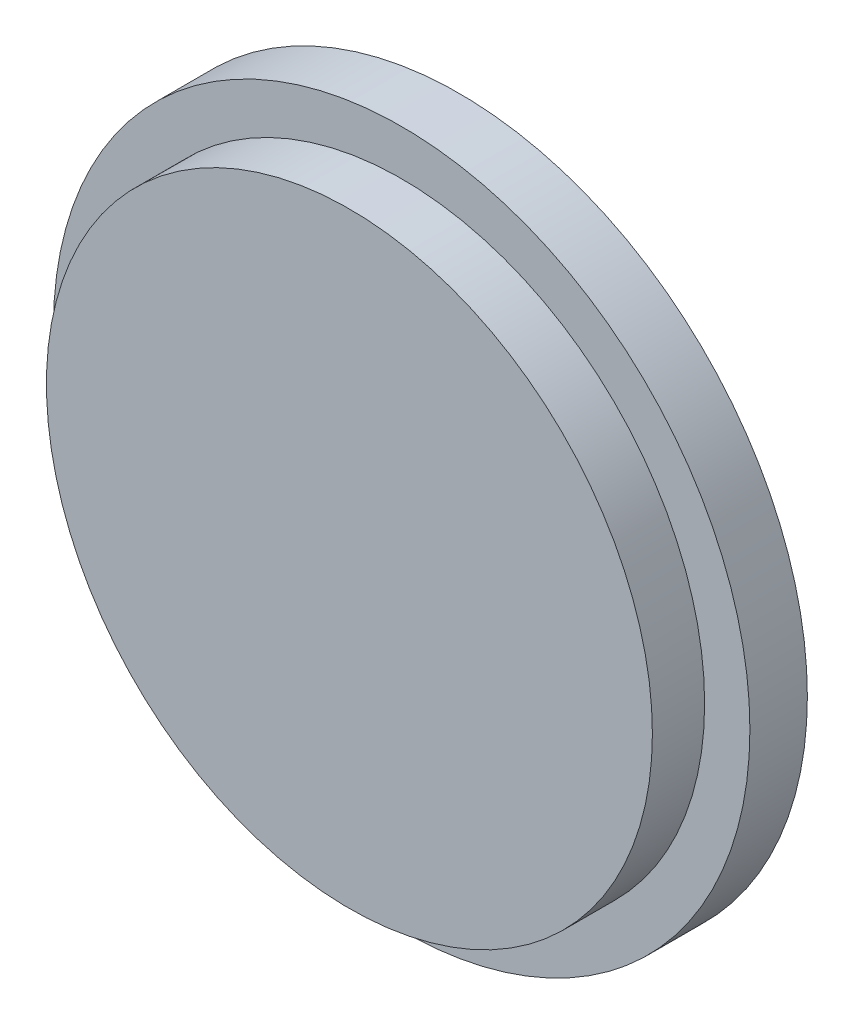
ISO-10303-21;
HEADER;
FILE_DESCRIPTION(('STEP AP214'),'2;1');
FILE_NAME('part.step','',(''),(''),'','','');
FILE_SCHEMA(('AUTOMOTIVE_DESIGN { 1 0 10303 214 1 1 1 1 }'));
ENDSEC;
DATA;
#1=APPLICATION_CONTEXT('core data for automotive mechanical design processes');
#2=APPLICATION_PROTOCOL_DEFINITION('international standard','automotive_design',2000,#1);
#3=PRODUCT_CONTEXT('',#1,'mechanical');
#4=PRODUCT('Part','Part','',(#3));
#5=PRODUCT_RELATED_PRODUCT_CATEGORY('part','',(#4));
#6=PRODUCT_DEFINITION_FORMATION('','',#4);
#7=PRODUCT_DEFINITION_CONTEXT('part definition',#1,'design');
#8=PRODUCT_DEFINITION('design','',#6,#7);
#9=PRODUCT_DEFINITION_SHAPE('','',#8);
#10=(LENGTH_UNIT() NAMED_UNIT(*) SI_UNIT(.MILLI.,.METRE.));
#11=(NAMED_UNIT(*) PLANE_ANGLE_UNIT() SI_UNIT($,.RADIAN.));
#12=(NAMED_UNIT(*) SI_UNIT($,.STERADIAN.) SOLID_ANGLE_UNIT());
#13=UNCERTAINTY_MEASURE_WITH_UNIT(LENGTH_MEASURE(1.E-05),#10,'distance_accuracy_value','');
#14=(GEOMETRIC_REPRESENTATION_CONTEXT(3) GLOBAL_UNCERTAINTY_ASSIGNED_CONTEXT((#13)) GLOBAL_UNIT_ASSIGNED_CONTEXT((#10,
#11,#12)) REPRESENTATION_CONTEXT('',''));
#15=CARTESIAN_POINT('',(0.,0.,0.));
#16=DIRECTION('',(0.,0.,1.));
#17=DIRECTION('',(1.,0.,0.));
#18=AXIS2_PLACEMENT_3D('',#15,#16,#17);
#19=CARTESIAN_POINT('',(0.,0.,3.3));
#20=DIRECTION('',(0.,0.,1.));
#21=DIRECTION('',(1.,0.,0.));
#22=AXIS2_PLACEMENT_3D('',#19,#20,#21);
#23=PLANE('',#22);
#24=CARTESIAN_POINT('',(0.,0.,3.3));
#25=DIRECTION('',(0.,0.,1.));
#26=DIRECTION('',(1.,0.,0.));
#27=AXIS2_PLACEMENT_3D('',#24,#25,#26);
#28=CIRCLE('',#27,20.);
#29=CARTESIAN_POINT('',(20.,0.,3.3));
#30=VERTEX_POINT('',#29);
#31=EDGE_CURVE('E10',#30,#30,#28,.T.);
#32=ORIENTED_EDGE('',*,*,#31,.T.);
#33=EDGE_LOOP('',(#32));
#34=FACE_BOUND('',#33,.T.);
#35=CARTESIAN_POINT('',(0.,0.,3.3));
#36=DIRECTION('',(0.,0.,1.));
#37=DIRECTION('',(1.,0.,0.));
#38=AXIS2_PLACEMENT_3D('',#35,#36,#37);
#39=CIRCLE('',#38,17.4);
#40=CARTESIAN_POINT('',(17.4,0.,3.3));
#41=VERTEX_POINT('',#40);
#42=EDGE_CURVE('E44',#41,#41,#39,.T.);
#43=ORIENTED_EDGE('',*,*,#42,.F.);
#44=EDGE_LOOP('',(#43));
#45=FACE_BOUND('',#44,.T.);
#46=ADVANCED_FACE('F33',(#34,#45),#23,.T.);
#47=CARTESIAN_POINT('',(0.,0.,0.));
#48=DIRECTION('',(0.,0.,1.));
#49=DIRECTION('',(1.,0.,0.));
#50=AXIS2_PLACEMENT_3D('',#47,#48,#49);
#51=PLANE('',#50);
#52=CARTESIAN_POINT('',(0.,0.,0.));
#53=DIRECTION('',(0.,0.,1.));
#54=DIRECTION('',(1.,0.,0.));
#55=AXIS2_PLACEMENT_3D('',#52,#53,#54);
#56=CIRCLE('',#55,20.);
#57=CARTESIAN_POINT('',(20.,0.,0.));
#58=VERTEX_POINT('',#57);
#59=EDGE_CURVE('E37',#58,#58,#56,.T.);
#60=ORIENTED_EDGE('',*,*,#59,.F.);
#61=EDGE_LOOP('',(#60));
#62=FACE_BOUND('',#61,.T.);
#63=ADVANCED_FACE('F63',(#62),#51,.F.);
#64=CARTESIAN_POINT('',(0.,0.,3.3));
#65=DIRECTION('',(0.,0.,-1.));
#66=DIRECTION('',(-1.,0.,0.));
#67=AXIS2_PLACEMENT_3D('',#64,#65,#66);
#68=CYLINDRICAL_SURFACE('',#67,20.);
#69=ORIENTED_EDGE('',*,*,#31,.F.);
#70=EDGE_LOOP('',(#69));
#71=FACE_BOUND('',#70,.T.);
#72=ORIENTED_EDGE('',*,*,#59,.T.);
#73=EDGE_LOOP('',(#72));
#74=FACE_BOUND('',#73,.T.);
#75=ADVANCED_FACE('F35',(#71,#74),#68,.T.);
#76=CARTESIAN_POINT('',(0.,0.,6.3));
#77=DIRECTION('',(0.,0.,-1.));
#78=DIRECTION('',(-1.,0.,0.));
#79=AXIS2_PLACEMENT_3D('',#76,#77,#78);
#80=CYLINDRICAL_SURFACE('',#79,17.4);
#81=ORIENTED_EDGE('',*,*,#42,.T.);
#82=EDGE_LOOP('',(#81));
#83=FACE_BOUND('',#82,.T.);
#84=CARTESIAN_POINT('',(0.,0.,6.3));
#85=DIRECTION('',(0.,0.,1.));
#86=DIRECTION('',(1.,0.,0.));
#87=AXIS2_PLACEMENT_3D('',#84,#85,#86);
#88=CIRCLE('',#87,17.4);
#89=CARTESIAN_POINT('',(17.4,0.,6.3));
#90=VERTEX_POINT('',#89);
#91=EDGE_CURVE('E48',#90,#90,#88,.T.);
#92=ORIENTED_EDGE('',*,*,#91,.F.);
#93=EDGE_LOOP('',(#92));
#94=FACE_BOUND('',#93,.T.);
#95=ADVANCED_FACE('F54',(#83,#94),#80,.T.);
#96=CARTESIAN_POINT('',(0.,0.,6.3));
#97=DIRECTION('',(0.,0.,1.));
#98=DIRECTION('',(1.,0.,0.));
#99=AXIS2_PLACEMENT_3D('',#96,#97,#98);
#100=PLANE('',#99);
#101=ORIENTED_EDGE('',*,*,#91,.T.);
#102=EDGE_LOOP('',(#101));
#103=FACE_BOUND('',#102,.T.);
#104=ADVANCED_FACE('F52',(#103),#100,.T.);
#105=CLOSED_SHELL('',(#46,#63,#75,#95,#104));
#106=MANIFOLD_SOLID_BREP('B2',#105);
#107=ADVANCED_BREP_SHAPE_REPRESENTATION('',(#18,#106),#14);
#108=SHAPE_DEFINITION_REPRESENTATION(#9,#107);
ENDSEC;
END-ISO-10303-21;
